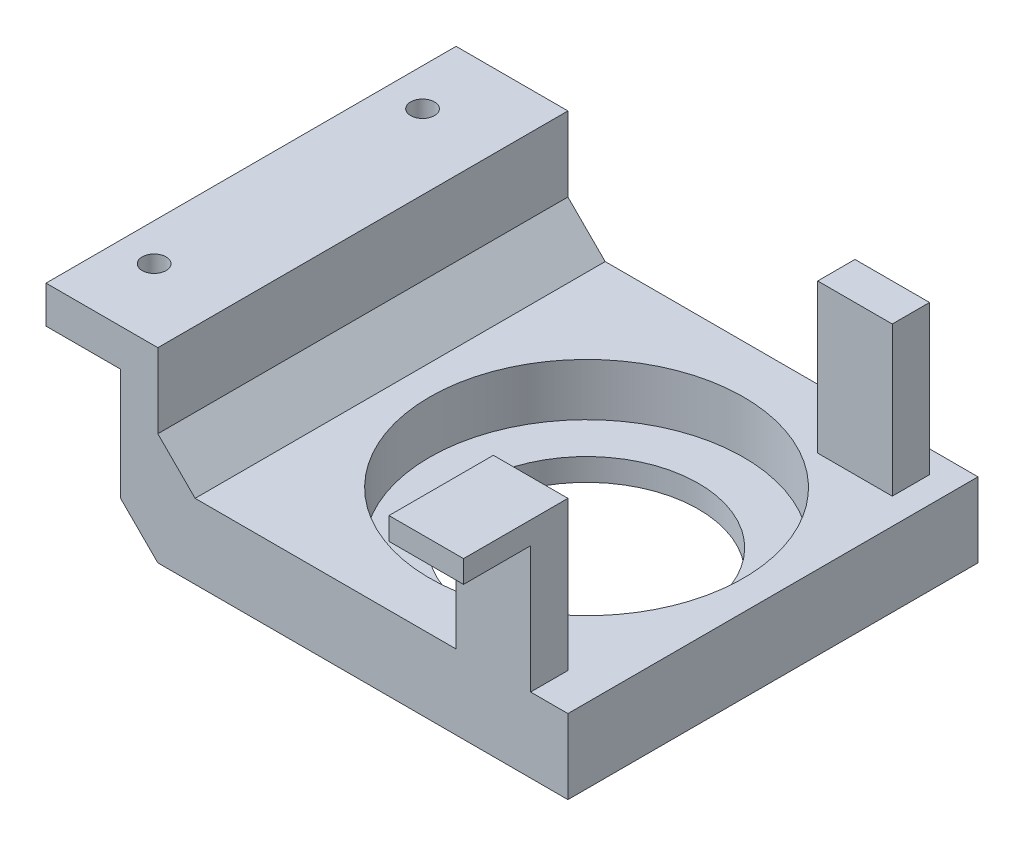
ISO-10303-21;
HEADER;
FILE_DESCRIPTION(('STEP AP214'),'2;1');
FILE_NAME('part.step','',(''),(''),'','','');
FILE_SCHEMA(('AUTOMOTIVE_DESIGN { 1 0 10303 214 1 1 1 1 }'));
ENDSEC;
DATA;
#1=APPLICATION_CONTEXT('core data for automotive mechanical design processes');
#2=APPLICATION_PROTOCOL_DEFINITION('international standard','automotive_design',2000,#1);
#3=PRODUCT_CONTEXT('',#1,'mechanical');
#4=PRODUCT('Part','Part','',(#3));
#5=PRODUCT_RELATED_PRODUCT_CATEGORY('part','',(#4));
#6=PRODUCT_DEFINITION_FORMATION('','',#4);
#7=PRODUCT_DEFINITION_CONTEXT('part definition',#1,'design');
#8=PRODUCT_DEFINITION('design','',#6,#7);
#9=PRODUCT_DEFINITION_SHAPE('','',#8);
#10=(LENGTH_UNIT() NAMED_UNIT(*) SI_UNIT(.MILLI.,.METRE.));
#11=(NAMED_UNIT(*) PLANE_ANGLE_UNIT() SI_UNIT($,.RADIAN.));
#12=(NAMED_UNIT(*) SI_UNIT($,.STERADIAN.) SOLID_ANGLE_UNIT());
#13=UNCERTAINTY_MEASURE_WITH_UNIT(LENGTH_MEASURE(1.E-05),#10,'distance_accuracy_value','');
#14=(GEOMETRIC_REPRESENTATION_CONTEXT(3) GLOBAL_UNCERTAINTY_ASSIGNED_CONTEXT((#13)) GLOBAL_UNIT_ASSIGNED_CONTEXT((#10,
#11,#12)) REPRESENTATION_CONTEXT('',''));
#15=CARTESIAN_POINT('',(0.,0.,0.));
#16=DIRECTION('',(0.,0.,1.));
#17=DIRECTION('',(1.,0.,0.));
#18=AXIS2_PLACEMENT_3D('',#15,#16,#17);
#19=CARTESIAN_POINT('',(-26.4285714285714,4.76190476190476,55.));
#20=DIRECTION('',(0.,-1.,0.));
#21=DIRECTION('',(0.,0.,-1.));
#22=AXIS2_PLACEMENT_3D('',#19,#20,#21);
#23=PLANE('',#22);
#24=DIRECTION('',(0.,0.,-1.));
#25=VECTOR('',#24,1.);
#26=CARTESIAN_POINT('',(23.5714285714286,4.76190476190476,55.));
#27=LINE('',#26,#25);
#28=CARTESIAN_POINT('',(23.5714285714286,4.76190476190476,55.));
#29=VERTEX_POINT('',#28);
#30=CARTESIAN_POINT('',(23.5714285714286,4.76190476190476,50.));
#31=VERTEX_POINT('',#30);
#32=EDGE_CURVE('E223',#29,#31,#27,.T.);
#33=ORIENTED_EDGE('',*,*,#32,.F.);
#34=DIRECTION('',(-1.,0.,0.));
#35=VECTOR('',#34,1.);
#36=CARTESIAN_POINT('',(-26.4285714285714,4.76190476190476,55.));
#37=LINE('',#36,#35);
#38=CARTESIAN_POINT('',(28.5714285714286,4.76190476190476,55.));
#39=VERTEX_POINT('',#38);
#40=EDGE_CURVE('E270',#39,#29,#37,.T.);
#41=ORIENTED_EDGE('',*,*,#40,.F.);
#42=DIRECTION('',(0.,0.,-1.));
#43=VECTOR('',#42,1.);
#44=CARTESIAN_POINT('',(28.5714285714286,4.76190476190476,55.));
#45=LINE('',#44,#43);
#46=CARTESIAN_POINT('',(28.5714285714286,4.76190476190476,0.));
#47=VERTEX_POINT('',#46);
#48=EDGE_CURVE('E319',#39,#47,#45,.T.);
#49=ORIENTED_EDGE('',*,*,#48,.T.);
#50=DIRECTION('',(-1.,0.,0.));
#51=VECTOR('',#50,1.);
#52=CARTESIAN_POINT('',(-26.4285714285714,4.76190476190476,0.));
#53=LINE('',#52,#51);
#54=CARTESIAN_POINT('',(-21.4285714285714,4.76190476190476,0.));
#55=VERTEX_POINT('',#54);
#56=EDGE_CURVE('E289',#47,#55,#53,.T.);
#57=ORIENTED_EDGE('',*,*,#56,.T.);
#58=DIRECTION('',(0.,0.,1.));
#59=VECTOR('',#58,1.);
#60=CARTESIAN_POINT('',(-21.4285714285714,4.76190476190476,55.));
#61=LINE('',#60,#59);
#62=CARTESIAN_POINT('',(-21.4285714285714,4.76190476190476,55.));
#63=VERTEX_POINT('',#62);
#64=EDGE_CURVE('E331',#55,#63,#61,.T.);
#65=ORIENTED_EDGE('',*,*,#64,.T.);
#66=CARTESIAN_POINT('',(13.5714285714286,4.76190476190476,55.));
#67=VERTEX_POINT('',#66);
#68=EDGE_CURVE('E268',#67,#63,#37,.T.);
#69=ORIENTED_EDGE('',*,*,#68,.F.);
#70=DIRECTION('',(0.,0.,1.));
#71=VECTOR('',#70,1.);
#72=CARTESIAN_POINT('',(13.5714285714286,4.76190476190476,50.));
#73=LINE('',#72,#71);
#74=CARTESIAN_POINT('',(13.5714285714286,4.76190476190476,50.));
#75=VERTEX_POINT('',#74);
#76=EDGE_CURVE('E227',#75,#67,#73,.T.);
#77=ORIENTED_EDGE('',*,*,#76,.F.);
#78=DIRECTION('',(-1.,0.,0.));
#79=VECTOR('',#78,1.);
#80=CARTESIAN_POINT('',(23.5714285714286,4.76190476190476,50.));
#81=LINE('',#80,#79);
#82=EDGE_CURVE('E233',#31,#75,#81,.T.);
#83=ORIENTED_EDGE('',*,*,#82,.F.);
#84=EDGE_LOOP('',(#33,#41,#49,#57,#65,#69,#77,#83));
#85=FACE_BOUND('',#84,.T.);
#86=CARTESIAN_POINT('',(3.57142857142857,4.76190476190476,27.5));
#87=DIRECTION('',(0.,1.,0.));
#88=DIRECTION('',(-1.,0.,0.));
#89=AXIS2_PLACEMENT_3D('',#86,#87,#88);
#90=CIRCLE('',#89,21.05);
#91=CARTESIAN_POINT('',(-17.4785714285714,4.76190476190476,27.5));
#92=VERTEX_POINT('',#91);
#93=EDGE_CURVE('E262',#92,#92,#90,.T.);
#94=ORIENTED_EDGE('',*,*,#93,.F.);
#95=EDGE_LOOP('',(#94));
#96=FACE_BOUND('',#95,.T.);
#97=DIRECTION('',(1.,0.,0.));
#98=VECTOR('',#97,1.);
#99=CARTESIAN_POINT('',(15.0714285714324,4.76190476190476,8.00000000000023));
#100=LINE('',#99,#98);
#101=CARTESIAN_POINT('',(15.0714285714324,4.76190476190476,8.00000000000023));
#102=VERTEX_POINT('',#101);
#103=CARTESIAN_POINT('',(25.0714285714324,4.76190476190476,8.00000000000023));
#104=VERTEX_POINT('',#103);
#105=EDGE_CURVE('E198',#102,#104,#100,.T.);
#106=ORIENTED_EDGE('',*,*,#105,.F.);
#107=DIRECTION('',(0.,0.,1.));
#108=VECTOR('',#107,1.);
#109=CARTESIAN_POINT('',(15.0714285714324,4.76190476190476,3.00000000000023));
#110=LINE('',#109,#108);
#111=CARTESIAN_POINT('',(15.0714285714324,4.76190476190476,3.00000000000023));
#112=VERTEX_POINT('',#111);
#113=EDGE_CURVE('E195',#112,#102,#110,.T.);
#114=ORIENTED_EDGE('',*,*,#113,.F.);
#115=DIRECTION('',(-1.,0.,0.));
#116=VECTOR('',#115,1.);
#117=CARTESIAN_POINT('',(25.0714285714324,4.76190476190476,3.00000000000023));
#118=LINE('',#117,#116);
#119=CARTESIAN_POINT('',(25.0714285714324,4.76190476190476,3.00000000000023));
#120=VERTEX_POINT('',#119);
#121=EDGE_CURVE('E62',#120,#112,#118,.T.);
#122=ORIENTED_EDGE('',*,*,#121,.F.);
#123=DIRECTION('',(0.,0.,-1.));
#124=VECTOR('',#123,1.);
#125=CARTESIAN_POINT('',(25.0714285714324,4.76190476190476,8.00000000000023));
#126=LINE('',#125,#124);
#127=EDGE_CURVE('E57',#104,#120,#126,.T.);
#128=ORIENTED_EDGE('',*,*,#127,.F.);
#129=EDGE_LOOP('',(#106,#114,#122,#128));
#130=FACE_BOUND('',#129,.T.);
#131=ADVANCED_FACE('F41',(#85,#96,#130),#23,.F.);
#132=CARTESIAN_POINT('',(28.5714285714286,4.76190476190476,55.));
#133=DIRECTION('',(-1.,0.,0.));
#134=DIRECTION('',(0.,0.,1.));
#135=AXIS2_PLACEMENT_3D('',#132,#133,#134);
#136=PLANE('',#135);
#137=DIRECTION('',(0.,1.,0.));
#138=VECTOR('',#137,1.);
#139=CARTESIAN_POINT('',(28.5714285714286,4.76190476190476,0.));
#140=LINE('',#139,#138);
#141=CARTESIAN_POINT('',(28.5714285714286,-5.23809523809524,0.));
#142=VERTEX_POINT('',#141);
#143=EDGE_CURVE('E261',#142,#47,#140,.T.);
#144=ORIENTED_EDGE('',*,*,#143,.T.);
#145=ORIENTED_EDGE('',*,*,#48,.F.);
#146=DIRECTION('',(0.,1.,0.));
#147=VECTOR('',#146,1.);
#148=CARTESIAN_POINT('',(28.5714285714286,4.76190476190476,55.));
#149=LINE('',#148,#147);
#150=CARTESIAN_POINT('',(28.5714285714286,-5.23809523809524,55.));
#151=VERTEX_POINT('',#150);
#152=EDGE_CURVE('E265',#151,#39,#149,.T.);
#153=ORIENTED_EDGE('',*,*,#152,.F.);
#154=DIRECTION('',(0.,0.,-1.));
#155=VECTOR('',#154,1.);
#156=CARTESIAN_POINT('',(28.5714285714286,-5.23809523809524,55.));
#157=LINE('',#156,#155);
#158=EDGE_CURVE('E286',#151,#142,#157,.T.);
#159=ORIENTED_EDGE('',*,*,#158,.T.);
#160=EDGE_LOOP('',(#144,#145,#153,#159));
#161=FACE_BOUND('',#160,.T.);
#162=ADVANCED_FACE('F390',(#161),#136,.F.);
#163=CARTESIAN_POINT('',(-26.4285714285714,19.7619047619048,55.));
#164=DIRECTION('',(-1.,0.,0.));
#165=DIRECTION('',(0.,-1.,0.));
#166=AXIS2_PLACEMENT_3D('',#163,#164,#165);
#167=PLANE('',#166);
#168=DIRECTION('',(0.,1.,0.));
#169=VECTOR('',#168,1.);
#170=CARTESIAN_POINT('',(-26.4285714285714,19.7619047619048,55.));
#171=LINE('',#170,#169);
#172=CARTESIAN_POINT('',(-26.4285714285714,9.76190476190479,55.));
#173=VERTEX_POINT('',#172);
#174=CARTESIAN_POINT('',(-26.4285714285714,19.7619047619048,55.));
#175=VERTEX_POINT('',#174);
#176=EDGE_CURVE('E273',#173,#175,#171,.T.);
#177=ORIENTED_EDGE('',*,*,#176,.F.);
#178=DIRECTION('',(0.,0.,-1.));
#179=VECTOR('',#178,1.);
#180=CARTESIAN_POINT('',(-26.4285714285714,9.76190476190479,0.));
#181=LINE('',#180,#179);
#182=CARTESIAN_POINT('',(-26.4285714285714,9.76190476190479,0.));
#183=VERTEX_POINT('',#182);
#184=EDGE_CURVE('E322',#173,#183,#181,.T.);
#185=ORIENTED_EDGE('',*,*,#184,.T.);
#186=DIRECTION('',(0.,1.,0.));
#187=VECTOR('',#186,1.);
#188=CARTESIAN_POINT('',(-26.4285714285714,19.7619047619048,0.));
#189=LINE('',#188,#187);
#190=CARTESIAN_POINT('',(-26.4285714285714,19.7619047619048,0.));
#191=VERTEX_POINT('',#190);
#192=EDGE_CURVE('E292',#183,#191,#189,.T.);
#193=ORIENTED_EDGE('',*,*,#192,.T.);
#194=DIRECTION('',(0.,0.,-1.));
#195=VECTOR('',#194,1.);
#196=CARTESIAN_POINT('',(-26.4285714285714,19.7619047619048,55.));
#197=LINE('',#196,#195);
#198=EDGE_CURVE('E316',#175,#191,#197,.T.);
#199=ORIENTED_EDGE('',*,*,#198,.F.);
#200=EDGE_LOOP('',(#177,#185,#193,#199));
#201=FACE_BOUND('',#200,.T.);
#202=ADVANCED_FACE('F363',(#201),#167,.F.);
#203=CARTESIAN_POINT('',(-41.4285714285714,19.7619047619048,55.));
#204=DIRECTION('',(0.,-1.,0.));
#205=DIRECTION('',(1.,0.,0.));
#206=AXIS2_PLACEMENT_3D('',#203,#204,#205);
#207=PLANE('',#206);
#208=CARTESIAN_POINT('',(-36.4285714285714,19.7619047619048,45.5));
#209=DIRECTION('',(0.,-1.,0.));
#210=DIRECTION('',(1.,0.,0.));
#211=AXIS2_PLACEMENT_3D('',#208,#209,#210);
#212=CIRCLE('',#211,1.6);
#213=CARTESIAN_POINT('',(-34.8285714285714,19.7619047619048,45.5));
#214=VERTEX_POINT('',#213);
#215=EDGE_CURVE('E247',#214,#214,#212,.T.);
#216=ORIENTED_EDGE('',*,*,#215,.T.);
#217=EDGE_LOOP('',(#216));
#218=FACE_BOUND('',#217,.T.);
#219=CARTESIAN_POINT('',(-36.4285714285714,19.7619047619048,9.5));
#220=DIRECTION('',(0.,-1.,0.));
#221=DIRECTION('',(-1.,0.,0.));
#222=AXIS2_PLACEMENT_3D('',#219,#220,#221);
#223=CIRCLE('',#222,1.6);
#224=CARTESIAN_POINT('',(-38.0285714285714,19.7619047619048,9.5));
#225=VERTEX_POINT('',#224);
#226=EDGE_CURVE('E246',#225,#225,#223,.T.);
#227=ORIENTED_EDGE('',*,*,#226,.T.);
#228=EDGE_LOOP('',(#227));
#229=FACE_BOUND('',#228,.T.);
#230=DIRECTION('',(-1.,0.,0.));
#231=VECTOR('',#230,1.);
#232=CARTESIAN_POINT('',(-41.4285714285714,19.7619047619048,0.));
#233=LINE('',#232,#231);
#234=CARTESIAN_POINT('',(-41.4285714285714,19.7619047619048,0.));
#235=VERTEX_POINT('',#234);
#236=EDGE_CURVE('E294',#191,#235,#233,.T.);
#237=ORIENTED_EDGE('',*,*,#236,.T.);
#238=DIRECTION('',(0.,0.,-1.));
#239=VECTOR('',#238,1.);
#240=CARTESIAN_POINT('',(-41.4285714285714,19.7619047619048,55.));
#241=LINE('',#240,#239);
#242=CARTESIAN_POINT('',(-41.4285714285714,19.7619047619048,55.));
#243=VERTEX_POINT('',#242);
#244=EDGE_CURVE('E313',#243,#235,#241,.T.);
#245=ORIENTED_EDGE('',*,*,#244,.F.);
#246=DIRECTION('',(-1.,0.,0.));
#247=VECTOR('',#246,1.);
#248=CARTESIAN_POINT('',(-41.4285714285714,19.7619047619048,55.));
#249=LINE('',#248,#247);
#250=EDGE_CURVE('E275',#175,#243,#249,.T.);
#251=ORIENTED_EDGE('',*,*,#250,.F.);
#252=ORIENTED_EDGE('',*,*,#198,.T.);
#253=EDGE_LOOP('',(#237,#245,#251,#252));
#254=FACE_BOUND('',#253,.T.);
#255=ADVANCED_FACE('F367',(#218,#229,#254),#207,.F.);
#256=CARTESIAN_POINT('',(-41.4285714285714,14.7619047619048,55.));
#257=DIRECTION('',(1.,0.,0.));
#258=DIRECTION('',(0.,0.,-1.));
#259=AXIS2_PLACEMENT_3D('',#256,#257,#258);
#260=PLANE('',#259);
#261=DIRECTION('',(0.,-1.,0.));
#262=VECTOR('',#261,1.);
#263=CARTESIAN_POINT('',(-41.4285714285714,14.7619047619048,0.));
#264=LINE('',#263,#262);
#265=CARTESIAN_POINT('',(-41.4285714285714,14.7619047619048,0.));
#266=VERTEX_POINT('',#265);
#267=EDGE_CURVE('E296',#235,#266,#264,.T.);
#268=ORIENTED_EDGE('',*,*,#267,.T.);
#269=DIRECTION('',(0.,0.,-1.));
#270=VECTOR('',#269,1.);
#271=CARTESIAN_POINT('',(-41.4285714285714,14.7619047619048,55.));
#272=LINE('',#271,#270);
#273=CARTESIAN_POINT('',(-41.4285714285714,14.7619047619048,55.));
#274=VERTEX_POINT('',#273);
#275=EDGE_CURVE('E310',#274,#266,#272,.T.);
#276=ORIENTED_EDGE('',*,*,#275,.F.);
#277=DIRECTION('',(0.,-1.,0.));
#278=VECTOR('',#277,1.);
#279=CARTESIAN_POINT('',(-41.4285714285714,14.7619047619048,55.));
#280=LINE('',#279,#278);
#281=EDGE_CURVE('E277',#243,#274,#280,.T.);
#282=ORIENTED_EDGE('',*,*,#281,.F.);
#283=ORIENTED_EDGE('',*,*,#244,.T.);
#284=EDGE_LOOP('',(#268,#276,#282,#283));
#285=FACE_BOUND('',#284,.T.);
#286=ADVANCED_FACE('F373',(#285),#260,.F.);
#287=CARTESIAN_POINT('',(-31.4285714285714,14.7619047619048,55.));
#288=DIRECTION('',(0.,1.,0.));
#289=DIRECTION('',(-1.,0.,0.));
#290=AXIS2_PLACEMENT_3D('',#287,#288,#289);
#291=PLANE('',#290);
#292=CARTESIAN_POINT('',(-36.4285714285714,14.7619047619048,45.5));
#293=DIRECTION('',(0.,1.,0.));
#294=DIRECTION('',(-1.,0.,0.));
#295=AXIS2_PLACEMENT_3D('',#292,#293,#294);
#296=CIRCLE('',#295,1.6);
#297=CARTESIAN_POINT('',(-38.0285714285714,14.7619047619048,45.5));
#298=VERTEX_POINT('',#297);
#299=EDGE_CURVE('E257',#298,#298,#296,.T.);
#300=ORIENTED_EDGE('',*,*,#299,.T.);
#301=EDGE_LOOP('',(#300));
#302=FACE_BOUND('',#301,.T.);
#303=CARTESIAN_POINT('',(-36.4285714285714,14.7619047619048,9.5));
#304=DIRECTION('',(0.,1.,0.));
#305=DIRECTION('',(-1.,0.,0.));
#306=AXIS2_PLACEMENT_3D('',#303,#304,#305);
#307=CIRCLE('',#306,1.6);
#308=CARTESIAN_POINT('',(-38.0285714285714,14.7619047619048,9.5));
#309=VERTEX_POINT('',#308);
#310=EDGE_CURVE('E250',#309,#309,#307,.T.);
#311=ORIENTED_EDGE('',*,*,#310,.T.);
#312=EDGE_LOOP('',(#311));
#313=FACE_BOUND('',#312,.T.);
#314=DIRECTION('',(1.,0.,0.));
#315=VECTOR('',#314,1.);
#316=CARTESIAN_POINT('',(-31.4285714285714,14.7619047619048,0.));
#317=LINE('',#316,#315);
#318=CARTESIAN_POINT('',(-31.4285714285714,14.7619047619048,0.));
#319=VERTEX_POINT('',#318);
#320=EDGE_CURVE('E298',#266,#319,#317,.T.);
#321=ORIENTED_EDGE('',*,*,#320,.T.);
#322=DIRECTION('',(0.,0.,-1.));
#323=VECTOR('',#322,1.);
#324=CARTESIAN_POINT('',(-31.4285714285714,14.7619047619048,55.));
#325=LINE('',#324,#323);
#326=CARTESIAN_POINT('',(-31.4285714285714,14.7619047619048,55.));
#327=VERTEX_POINT('',#326);
#328=EDGE_CURVE('E307',#327,#319,#325,.T.);
#329=ORIENTED_EDGE('',*,*,#328,.F.);
#330=DIRECTION('',(1.,0.,0.));
#331=VECTOR('',#330,1.);
#332=CARTESIAN_POINT('',(-31.4285714285714,14.7619047619048,55.));
#333=LINE('',#332,#331);
#334=EDGE_CURVE('E279',#274,#327,#333,.T.);
#335=ORIENTED_EDGE('',*,*,#334,.F.);
#336=ORIENTED_EDGE('',*,*,#275,.T.);
#337=EDGE_LOOP('',(#321,#329,#335,#336));
#338=FACE_BOUND('',#337,.T.);
#339=ADVANCED_FACE('F377',(#302,#313,#338),#291,.F.);
#340=CARTESIAN_POINT('',(-31.4285714285714,5.76190476190476,55.));
#341=DIRECTION('',(1.,0.,0.));
#342=DIRECTION('',(0.,0.,-1.));
#343=AXIS2_PLACEMENT_3D('',#340,#341,#342);
#344=PLANE('',#343);
#345=DIRECTION('',(0.,-1.,0.));
#346=VECTOR('',#345,1.);
#347=CARTESIAN_POINT('',(-31.4285714285714,5.76190476190476,0.));
#348=LINE('',#347,#346);
#349=CARTESIAN_POINT('',(-31.4285714285714,-0.238095238095233,0.));
#350=VERTEX_POINT('',#349);
#351=EDGE_CURVE('E301',#319,#350,#348,.T.);
#352=ORIENTED_EDGE('',*,*,#351,.T.);
#353=DIRECTION('',(0.,0.,1.));
#354=VECTOR('',#353,1.);
#355=CARTESIAN_POINT('',(-31.4285714285714,-0.238095238095233,55.));
#356=LINE('',#355,#354);
#357=CARTESIAN_POINT('',(-31.4285714285714,-0.238095238095233,55.));
#358=VERTEX_POINT('',#357);
#359=EDGE_CURVE('E339',#350,#358,#356,.T.);
#360=ORIENTED_EDGE('',*,*,#359,.T.);
#361=DIRECTION('',(0.,-1.,0.));
#362=VECTOR('',#361,1.);
#363=CARTESIAN_POINT('',(-31.4285714285714,5.76190476190476,55.));
#364=LINE('',#363,#362);
#365=EDGE_CURVE('E281',#327,#358,#364,.T.);
#366=ORIENTED_EDGE('',*,*,#365,.F.);
#367=ORIENTED_EDGE('',*,*,#328,.T.);
#368=EDGE_LOOP('',(#352,#360,#366,#367));
#369=FACE_BOUND('',#368,.T.);
#370=ADVANCED_FACE('F380',(#369),#344,.F.);
#371=CARTESIAN_POINT('',(-31.4285714285714,-5.23809523809524,55.));
#372=DIRECTION('',(0.,1.,0.));
#373=DIRECTION('',(0.,0.,1.));
#374=AXIS2_PLACEMENT_3D('',#371,#372,#373);
#375=PLANE('',#374);
#376=CARTESIAN_POINT('',(3.57142857142857,-5.23809523809524,27.5));
#377=DIRECTION('',(0.,1.,0.));
#378=DIRECTION('',(-1.,0.,0.));
#379=AXIS2_PLACEMENT_3D('',#376,#377,#378);
#380=CIRCLE('',#379,15.);
#381=CARTESIAN_POINT('',(-11.4285714285714,-5.23809523809524,27.5));
#382=VERTEX_POINT('',#381);
#383=EDGE_CURVE('E253',#382,#382,#380,.T.);
#384=ORIENTED_EDGE('',*,*,#383,.T.);
#385=EDGE_LOOP('',(#384));
#386=FACE_BOUND('',#385,.T.);
#387=DIRECTION('',(1.,0.,0.));
#388=VECTOR('',#387,1.);
#389=CARTESIAN_POINT('',(-31.4285714285714,-5.23809523809524,55.));
#390=LINE('',#389,#388);
#391=CARTESIAN_POINT('',(-26.4285714285714,-5.23809523809524,55.));
#392=VERTEX_POINT('',#391);
#393=EDGE_CURVE('E284',#392,#151,#390,.T.);
#394=ORIENTED_EDGE('',*,*,#393,.F.);
#395=DIRECTION('',(0.,0.,-1.));
#396=VECTOR('',#395,1.);
#397=CARTESIAN_POINT('',(-26.4285714285714,-5.23809523809524,55.));
#398=LINE('',#397,#396);
#399=CARTESIAN_POINT('',(-26.4285714285714,-5.23809523809524,0.));
#400=VERTEX_POINT('',#399);
#401=EDGE_CURVE('E334',#392,#400,#398,.T.);
#402=ORIENTED_EDGE('',*,*,#401,.T.);
#403=DIRECTION('',(1.,0.,0.));
#404=VECTOR('',#403,1.);
#405=CARTESIAN_POINT('',(-31.4285714285714,-5.23809523809524,0.));
#406=LINE('',#405,#404);
#407=EDGE_CURVE('E269',#400,#142,#406,.T.);
#408=ORIENTED_EDGE('',*,*,#407,.T.);
#409=ORIENTED_EDGE('',*,*,#158,.F.);
#410=EDGE_LOOP('',(#394,#402,#408,#409));
#411=FACE_BOUND('',#410,.T.);
#412=ADVANCED_FACE('F387',(#386,#411),#375,.F.);
#413=CARTESIAN_POINT('',(0.,0.,55.));
#414=DIRECTION('',(0.,0.,1.));
#415=DIRECTION('',(1.,0.,0.));
#416=AXIS2_PLACEMENT_3D('',#413,#414,#415);
#417=PLANE('',#416);
#418=DIRECTION('',(1.,0.,0.));
#419=VECTOR('',#418,1.);
#420=CARTESIAN_POINT('',(13.5714285714286,21.7619047619048,55.));
#421=LINE('',#420,#419);
#422=CARTESIAN_POINT('',(13.5714285714286,21.7619047619048,55.));
#423=VERTEX_POINT('',#422);
#424=CARTESIAN_POINT('',(23.5714285714286,21.7619047619048,55.));
#425=VERTEX_POINT('',#424);
#426=EDGE_CURVE('E199',#423,#425,#421,.T.);
#427=ORIENTED_EDGE('',*,*,#426,.F.);
#428=DIRECTION('',(0.,-1.,0.));
#429=VECTOR('',#428,1.);
#430=CARTESIAN_POINT('',(13.5714285714286,24.7619047619048,55.));
#431=LINE('',#430,#429);
#432=EDGE_CURVE('E231',#423,#67,#431,.T.);
#433=ORIENTED_EDGE('',*,*,#432,.T.);
#434=ORIENTED_EDGE('',*,*,#68,.T.);
#435=DIRECTION('',(0.707106781186544,-0.707106781186551,0.));
#436=VECTOR('',#435,1.);
#437=CARTESIAN_POINT('',(-26.4285714285714,9.7619047619048,55.));
#438=LINE('',#437,#436);
#439=EDGE_CURVE('E11',#63,#173,#438,.F.);
#440=ORIENTED_EDGE('',*,*,#439,.T.);
#441=ORIENTED_EDGE('',*,*,#176,.T.);
#442=ORIENTED_EDGE('',*,*,#250,.T.);
#443=ORIENTED_EDGE('',*,*,#281,.T.);
#444=ORIENTED_EDGE('',*,*,#334,.T.);
#445=ORIENTED_EDGE('',*,*,#365,.T.);
#446=DIRECTION('',(-0.707106781186546,0.707106781186549,0.));
#447=VECTOR('',#446,1.);
#448=CARTESIAN_POINT('',(-15.8333333333334,-15.8333333333333,55.));
#449=LINE('',#448,#447);
#450=EDGE_CURVE('E341',#358,#392,#449,.F.);
#451=ORIENTED_EDGE('',*,*,#450,.T.);
#452=ORIENTED_EDGE('',*,*,#393,.T.);
#453=ORIENTED_EDGE('',*,*,#152,.T.);
#454=ORIENTED_EDGE('',*,*,#40,.T.);
#455=DIRECTION('',(0.,-1.,0.));
#456=VECTOR('',#455,1.);
#457=CARTESIAN_POINT('',(23.5714285714286,24.7619047619048,55.));
#458=LINE('',#457,#456);
#459=EDGE_CURVE('E244',#425,#29,#458,.T.);
#460=ORIENTED_EDGE('',*,*,#459,.F.);
#461=EDGE_LOOP('',(#427,#433,#434,#440,#441,#442,#443,#444,#445,#451,#452,#453,#454,#460));
#462=FACE_BOUND('',#461,.T.);
#463=ADVANCED_FACE('F360',(#462),#417,.T.);
#464=CARTESIAN_POINT('',(0.,0.,0.));
#465=DIRECTION('',(0.,0.,1.));
#466=DIRECTION('',(1.,0.,0.));
#467=AXIS2_PLACEMENT_3D('',#464,#465,#466);
#468=PLANE('',#467);
#469=ORIENTED_EDGE('',*,*,#407,.F.);
#470=DIRECTION('',(0.707106781186546,-0.707106781186549,0.));
#471=VECTOR('',#470,1.);
#472=CARTESIAN_POINT('',(-26.4285714285714,-5.23809523809524,0.));
#473=LINE('',#472,#471);
#474=EDGE_CURVE('E337',#400,#350,#473,.F.);
#475=ORIENTED_EDGE('',*,*,#474,.T.);
#476=ORIENTED_EDGE('',*,*,#351,.F.);
#477=ORIENTED_EDGE('',*,*,#320,.F.);
#478=ORIENTED_EDGE('',*,*,#267,.F.);
#479=ORIENTED_EDGE('',*,*,#236,.F.);
#480=ORIENTED_EDGE('',*,*,#192,.F.);
#481=DIRECTION('',(-0.707106781186544,0.707106781186551,0.));
#482=VECTOR('',#481,1.);
#483=CARTESIAN_POINT('',(-8.33333333333343,-8.33333333333336,0.));
#484=LINE('',#483,#482);
#485=EDGE_CURVE('E50',#183,#55,#484,.F.);
#486=ORIENTED_EDGE('',*,*,#485,.T.);
#487=ORIENTED_EDGE('',*,*,#56,.F.);
#488=ORIENTED_EDGE('',*,*,#143,.F.);
#489=EDGE_LOOP('',(#469,#475,#476,#477,#478,#479,#480,#486,#487,#488));
#490=FACE_BOUND('',#489,.T.);
#491=ADVANCED_FACE('F345',(#490),#468,.F.);
#492=CARTESIAN_POINT('',(3.57142857142857,-2.23809523809524,27.5));
#493=DIRECTION('',(0.,1.,0.));
#494=DIRECTION('',(-1.,0.,0.));
#495=AXIS2_PLACEMENT_3D('',#492,#493,#494);
#496=CYLINDRICAL_SURFACE('',#495,21.05);
#497=CARTESIAN_POINT('',(3.57142857142857,-2.23809523809524,27.5));
#498=DIRECTION('',(0.,1.,0.));
#499=DIRECTION('',(-1.,0.,0.));
#500=AXIS2_PLACEMENT_3D('',#497,#498,#499);
#501=CIRCLE('',#500,21.05);
#502=CARTESIAN_POINT('',(-17.4785714285714,-2.23809523809524,27.5));
#503=VERTEX_POINT('',#502);
#504=EDGE_CURVE('E258',#503,#503,#501,.T.);
#505=ORIENTED_EDGE('',*,*,#504,.F.);
#506=EDGE_LOOP('',(#505));
#507=FACE_BOUND('',#506,.T.);
#508=ORIENTED_EDGE('',*,*,#93,.T.);
#509=EDGE_LOOP('',(#508));
#510=FACE_BOUND('',#509,.T.);
#511=ADVANCED_FACE('F466',(#507,#510),#496,.F.);
#512=CARTESIAN_POINT('',(3.57142857142857,-2.23809523809524,27.5));
#513=DIRECTION('',(0.,1.,0.));
#514=DIRECTION('',(-1.,0.,0.));
#515=AXIS2_PLACEMENT_3D('',#512,#513,#514);
#516=PLANE('',#515);
#517=CARTESIAN_POINT('',(3.57142857142857,-2.23809523809524,27.5));
#518=DIRECTION('',(0.,1.,0.));
#519=DIRECTION('',(-1.,0.,0.));
#520=AXIS2_PLACEMENT_3D('',#517,#518,#519);
#521=CIRCLE('',#520,15.);
#522=CARTESIAN_POINT('',(-11.4285714285714,-2.23809523809524,27.5));
#523=VERTEX_POINT('',#522);
#524=EDGE_CURVE('E256',#523,#523,#521,.T.);
#525=ORIENTED_EDGE('',*,*,#524,.F.);
#526=EDGE_LOOP('',(#525));
#527=FACE_BOUND('',#526,.T.);
#528=ORIENTED_EDGE('',*,*,#504,.T.);
#529=EDGE_LOOP('',(#528));
#530=FACE_BOUND('',#529,.T.);
#531=ADVANCED_FACE('F462',(#527,#530),#516,.T.);
#532=CARTESIAN_POINT('',(3.57142857142857,-5.23809523809524,27.5));
#533=DIRECTION('',(0.,1.,0.));
#534=DIRECTION('',(-1.,0.,0.));
#535=AXIS2_PLACEMENT_3D('',#532,#533,#534);
#536=CYLINDRICAL_SURFACE('',#535,15.);
#537=CARTESIAN_POINT('',(-11.4285714285714,-2.23809523809524,27.5));
#538=CARTESIAN_POINT('',(-11.4285714285714,-2.26934523809524,27.5));
#539=CARTESIAN_POINT('',(-11.4285714285714,-2.30059523809524,27.5));
#540=CARTESIAN_POINT('',(-11.4285714285714,-2.36309523809524,27.5));
#541=CARTESIAN_POINT('',(-11.4285714285714,-2.39434523809524,27.5));
#542=CARTESIAN_POINT('',(-11.4285714285714,-2.45684523809524,27.5));
#543=CARTESIAN_POINT('',(-11.4285714285714,-2.48809523809524,27.5));
#544=CARTESIAN_POINT('',(-11.4285714285714,-2.55059523809524,27.5));
#545=CARTESIAN_POINT('',(-11.4285714285714,-2.58184523809524,27.5));
#546=CARTESIAN_POINT('',(-11.4285714285714,-2.64434523809524,27.5));
#547=CARTESIAN_POINT('',(-11.4285714285714,-2.67559523809524,27.5));
#548=CARTESIAN_POINT('',(-11.4285714285714,-2.73809523809524,27.5));
#549=CARTESIAN_POINT('',(-11.4285714285714,-2.76934523809524,27.5));
#550=CARTESIAN_POINT('',(-11.4285714285714,-2.83184523809524,27.5));
#551=CARTESIAN_POINT('',(-11.4285714285714,-2.86309523809524,27.5));
#552=CARTESIAN_POINT('',(-11.4285714285714,-2.92559523809524,27.5));
#553=CARTESIAN_POINT('',(-11.4285714285714,-2.95684523809524,27.5));
#554=CARTESIAN_POINT('',(-11.4285714285714,-3.01934523809524,27.5));
#555=CARTESIAN_POINT('',(-11.4285714285714,-3.05059523809524,27.5));
#556=CARTESIAN_POINT('',(-11.4285714285714,-3.11309523809524,27.5));
#557=CARTESIAN_POINT('',(-11.4285714285714,-3.14434523809524,27.5));
#558=CARTESIAN_POINT('',(-11.4285714285714,-3.20684523809524,27.5));
#559=CARTESIAN_POINT('',(-11.4285714285714,-3.23809523809524,27.5));
#560=CARTESIAN_POINT('',(-11.4285714285714,-3.30059523809524,27.5));
#561=CARTESIAN_POINT('',(-11.4285714285714,-3.33184523809524,27.5));
#562=CARTESIAN_POINT('',(-11.4285714285714,-3.39434523809524,27.5));
#563=CARTESIAN_POINT('',(-11.4285714285714,-3.42559523809524,27.5));
#564=CARTESIAN_POINT('',(-11.4285714285714,-3.48809523809524,27.5));
#565=CARTESIAN_POINT('',(-11.4285714285714,-3.51934523809524,27.5));
#566=CARTESIAN_POINT('',(-11.4285714285714,-3.58184523809524,27.5));
#567=CARTESIAN_POINT('',(-11.4285714285714,-3.61309523809524,27.5));
#568=CARTESIAN_POINT('',(-11.4285714285714,-3.67559523809524,27.5));
#569=CARTESIAN_POINT('',(-11.4285714285714,-3.70684523809524,27.5));
#570=CARTESIAN_POINT('',(-11.4285714285714,-3.76934523809524,27.5));
#571=CARTESIAN_POINT('',(-11.4285714285714,-3.80059523809524,27.5));
#572=CARTESIAN_POINT('',(-11.4285714285714,-3.86309523809524,27.5));
#573=CARTESIAN_POINT('',(-11.4285714285714,-3.89434523809524,27.5));
#574=CARTESIAN_POINT('',(-11.4285714285714,-3.95684523809524,27.5));
#575=CARTESIAN_POINT('',(-11.4285714285714,-3.98809523809524,27.5));
#576=CARTESIAN_POINT('',(-11.4285714285714,-4.05059523809524,27.5));
#577=CARTESIAN_POINT('',(-11.4285714285714,-4.08184523809524,27.5));
#578=CARTESIAN_POINT('',(-11.4285714285714,-4.14434523809524,27.5));
#579=CARTESIAN_POINT('',(-11.4285714285714,-4.17559523809524,27.5));
#580=CARTESIAN_POINT('',(-11.4285714285714,-4.23809523809524,27.5));
#581=CARTESIAN_POINT('',(-11.4285714285714,-4.26934523809524,27.5));
#582=CARTESIAN_POINT('',(-11.4285714285714,-4.33184523809524,27.5));
#583=CARTESIAN_POINT('',(-11.4285714285714,-4.36309523809524,27.5));
#584=CARTESIAN_POINT('',(-11.4285714285714,-4.42559523809524,27.5));
#585=CARTESIAN_POINT('',(-11.4285714285714,-4.45684523809524,27.5));
#586=CARTESIAN_POINT('',(-11.4285714285714,-4.51934523809524,27.5));
#587=CARTESIAN_POINT('',(-11.4285714285714,-4.55059523809524,27.5));
#588=CARTESIAN_POINT('',(-11.4285714285714,-4.61309523809524,27.5));
#589=CARTESIAN_POINT('',(-11.4285714285714,-4.64434523809524,27.5));
#590=CARTESIAN_POINT('',(-11.4285714285714,-4.70684523809524,27.5));
#591=CARTESIAN_POINT('',(-11.4285714285714,-4.73809523809524,27.5));
#592=CARTESIAN_POINT('',(-11.4285714285714,-4.80059523809524,27.5));
#593=CARTESIAN_POINT('',(-11.4285714285714,-4.83184523809524,27.5));
#594=CARTESIAN_POINT('',(-11.4285714285714,-4.89434523809524,27.5));
#595=CARTESIAN_POINT('',(-11.4285714285714,-4.92559523809524,27.5));
#596=CARTESIAN_POINT('',(-11.4285714285714,-4.98809523809524,27.5));
#597=CARTESIAN_POINT('',(-11.4285714285714,-5.01934523809524,27.5));
#598=CARTESIAN_POINT('',(-11.4285714285714,-5.08184523809524,27.5));
#599=CARTESIAN_POINT('',(-11.4285714285714,-5.11309523809524,27.5));
#600=CARTESIAN_POINT('',(-11.4285714285714,-5.17559523809524,27.5));
#601=CARTESIAN_POINT('',(-11.4285714285714,-5.20684523809524,27.5));
#602=CARTESIAN_POINT('',(-11.4285714285714,-5.23809523809524,27.5));
#603=B_SPLINE_CURVE_WITH_KNOTS('',3,(#537,#538,#539,#540,#541,#542,#543,#544,#545,#546,#547,
#548,#549,#550,#551,#552,#553,#554,#555,#556,#557,#558,#559,#560,#561,#562,#563,#564,#565,#566,
#567,#568,#569,#570,#571,#572,#573,#574,#575,#576,#577,#578,#579,#580,#581,#582,#583,#584,#585,
#586,#587,#588,#589,#590,#591,#592,#593,#594,#595,#596,#597,#598,#599,#600,#601,#602),
.UNSPECIFIED.,.F.,.F.,(4,2,2,2,2,2,2,2,2,2,2,2,2,2,2,2,2,2,2,2,2,2,2,2,2,2,2,2,2,2,2,2,4),(0.,
0.0937500000000001,0.1875,0.28125,0.375,0.46875,0.5625,0.65625,0.75,0.84375,0.9375,1.03125,
1.125,1.21875,1.3125,1.40625,1.5,1.59375,1.6875,1.78125,1.875,1.96875,2.0625,2.15625,2.25,
2.34375,2.4375,2.53125,2.625,2.71875,2.8125,2.90625,3.),.UNSPECIFIED.);
#604=EDGE_CURVE('BSEAM453',#523,#382,#603,.T.);
#605=ORIENTED_EDGE('',*,*,#524,.T.);
#606=ORIENTED_EDGE('',*,*,#383,.F.);
#607=ORIENTED_EDGE('',*,*,#604,.T.);
#608=ORIENTED_EDGE('',*,*,#604,.F.);
#609=EDGE_LOOP('',(#605,#607,#606,#608));
#610=FACE_BOUND('',#609,.T.);
#611=ADVANCED_FACE('F453',(#610),#536,.F.);
#612=CARTESIAN_POINT('',(-36.4285714285714,19.7619047619048,9.5));
#613=DIRECTION('',(0.,-1.,0.));
#614=DIRECTION('',(1.,0.,0.));
#615=AXIS2_PLACEMENT_3D('',#612,#613,#614);
#616=CYLINDRICAL_SURFACE('',#615,1.6);
#617=ORIENTED_EDGE('',*,*,#226,.F.);
#618=EDGE_LOOP('',(#617));
#619=FACE_BOUND('',#618,.T.);
#620=ORIENTED_EDGE('',*,*,#310,.F.);
#621=EDGE_LOOP('',(#620));
#622=FACE_BOUND('',#621,.T.);
#623=ADVANCED_FACE('F446',(#619,#622),#616,.F.);
#624=CARTESIAN_POINT('',(-36.4285714285714,19.7619047619048,45.5));
#625=DIRECTION('',(0.,-1.,0.));
#626=DIRECTION('',(1.,0.,0.));
#627=AXIS2_PLACEMENT_3D('',#624,#625,#626);
#628=CYLINDRICAL_SURFACE('',#627,1.6);
#629=ORIENTED_EDGE('',*,*,#215,.F.);
#630=EDGE_LOOP('',(#629));
#631=FACE_BOUND('',#630,.T.);
#632=ORIENTED_EDGE('',*,*,#299,.F.);
#633=EDGE_LOOP('',(#632));
#634=FACE_BOUND('',#633,.T.);
#635=ADVANCED_FACE('F440',(#631,#634),#628,.F.);
#636=CARTESIAN_POINT('',(-26.4285714285714,9.7619047619048,55.));
#637=DIRECTION('',(0.707106781186551,0.707106781186544,0.));
#638=DIRECTION('',(0.,0.,1.));
#639=AXIS2_PLACEMENT_3D('',#636,#637,#638);
#640=PLANE('',#639);
#641=ORIENTED_EDGE('',*,*,#439,.F.);
#642=ORIENTED_EDGE('',*,*,#64,.F.);
#643=ORIENTED_EDGE('',*,*,#485,.F.);
#644=ORIENTED_EDGE('',*,*,#184,.F.);
#645=EDGE_LOOP('',(#641,#642,#643,#644));
#646=FACE_BOUND('',#645,.T.);
#647=ADVANCED_FACE('F357',(#646),#640,.T.);
#648=CARTESIAN_POINT('',(-26.4285714285714,-5.23809523809524,55.));
#649=DIRECTION('',(0.707106781186549,0.707106781186546,0.));
#650=DIRECTION('',(0.,0.,-1.));
#651=AXIS2_PLACEMENT_3D('',#648,#649,#650);
#652=PLANE('',#651);
#653=ORIENTED_EDGE('',*,*,#450,.F.);
#654=ORIENTED_EDGE('',*,*,#359,.F.);
#655=ORIENTED_EDGE('',*,*,#474,.F.);
#656=ORIENTED_EDGE('',*,*,#401,.F.);
#657=EDGE_LOOP('',(#653,#654,#655,#656));
#658=FACE_BOUND('',#657,.T.);
#659=ADVANCED_FACE('F44',(#658),#652,.F.);
#660=CARTESIAN_POINT('',(23.5714285714286,24.7619047619048,55.));
#661=DIRECTION('',(-1.,0.,0.));
#662=DIRECTION('',(0.,0.,1.));
#663=AXIS2_PLACEMENT_3D('',#660,#661,#662);
#664=PLANE('',#663);
#665=ORIENTED_EDGE('',*,*,#32,.T.);
#666=DIRECTION('',(0.,-1.,0.));
#667=VECTOR('',#666,1.);
#668=CARTESIAN_POINT('',(23.5714285714286,24.7619047619048,50.));
#669=LINE('',#668,#667);
#670=CARTESIAN_POINT('',(23.5714285714286,24.7619047619048,50.));
#671=VERTEX_POINT('',#670);
#672=EDGE_CURVE('E241',#671,#31,#669,.T.);
#673=ORIENTED_EDGE('',*,*,#672,.F.);
#674=DIRECTION('',(0.,0.,-1.));
#675=VECTOR('',#674,1.);
#676=CARTESIAN_POINT('',(23.5714285714286,24.7619047619048,55.));
#677=LINE('',#676,#675);
#678=CARTESIAN_POINT('',(23.5714285714286,24.7619047619048,64.));
#679=VERTEX_POINT('',#678);
#680=EDGE_CURVE('E224',#679,#671,#677,.T.);
#681=ORIENTED_EDGE('',*,*,#680,.F.);
#682=DIRECTION('',(0.,1.,0.));
#683=VECTOR('',#682,1.);
#684=CARTESIAN_POINT('',(23.5714285714286,21.7619047619048,64.));
#685=LINE('',#684,#683);
#686=CARTESIAN_POINT('',(23.5714285714286,21.7619047619048,64.));
#687=VERTEX_POINT('',#686);
#688=EDGE_CURVE('E214',#687,#679,#685,.T.);
#689=ORIENTED_EDGE('',*,*,#688,.F.);
#690=DIRECTION('',(0.,0.,-1.));
#691=VECTOR('',#690,1.);
#692=CARTESIAN_POINT('',(23.5714285714286,21.7619047619048,64.));
#693=LINE('',#692,#691);
#694=EDGE_CURVE('E216',#687,#425,#693,.T.);
#695=ORIENTED_EDGE('',*,*,#694,.T.);
#696=ORIENTED_EDGE('',*,*,#459,.T.);
#697=EDGE_LOOP('',(#665,#673,#681,#689,#695,#696));
#698=FACE_BOUND('',#697,.T.);
#699=ADVANCED_FACE('F396',(#698),#664,.F.);
#700=CARTESIAN_POINT('',(23.5714285714286,24.7619047619048,50.));
#701=DIRECTION('',(0.,0.,1.));
#702=DIRECTION('',(1.,0.,0.));
#703=AXIS2_PLACEMENT_3D('',#700,#701,#702);
#704=PLANE('',#703);
#705=ORIENTED_EDGE('',*,*,#82,.T.);
#706=DIRECTION('',(0.,-1.,0.));
#707=VECTOR('',#706,1.);
#708=CARTESIAN_POINT('',(13.5714285714286,24.7619047619048,50.));
#709=LINE('',#708,#707);
#710=CARTESIAN_POINT('',(13.5714285714286,24.7619047619048,50.));
#711=VERTEX_POINT('',#710);
#712=EDGE_CURVE('E238',#711,#75,#709,.T.);
#713=ORIENTED_EDGE('',*,*,#712,.F.);
#714=DIRECTION('',(-1.,0.,0.));
#715=VECTOR('',#714,1.);
#716=CARTESIAN_POINT('',(23.5714285714286,24.7619047619048,50.));
#717=LINE('',#716,#715);
#718=EDGE_CURVE('E226',#671,#711,#717,.T.);
#719=ORIENTED_EDGE('',*,*,#718,.F.);
#720=ORIENTED_EDGE('',*,*,#672,.T.);
#721=EDGE_LOOP('',(#705,#713,#719,#720));
#722=FACE_BOUND('',#721,.T.);
#723=ADVANCED_FACE('F399',(#722),#704,.F.);
#724=CARTESIAN_POINT('',(13.5714285714286,24.7619047619048,50.));
#725=DIRECTION('',(1.,0.,0.));
#726=DIRECTION('',(0.,0.,-1.));
#727=AXIS2_PLACEMENT_3D('',#724,#725,#726);
#728=PLANE('',#727);
#729=ORIENTED_EDGE('',*,*,#76,.T.);
#730=ORIENTED_EDGE('',*,*,#432,.F.);
#731=DIRECTION('',(0.,0.,-1.));
#732=VECTOR('',#731,1.);
#733=CARTESIAN_POINT('',(13.5714285714286,21.7619047619048,64.));
#734=LINE('',#733,#732);
#735=CARTESIAN_POINT('',(13.5714285714286,21.7619047619048,64.));
#736=VERTEX_POINT('',#735);
#737=EDGE_CURVE('E220',#736,#423,#734,.T.);
#738=ORIENTED_EDGE('',*,*,#737,.F.);
#739=DIRECTION('',(0.,-1.,0.));
#740=VECTOR('',#739,1.);
#741=CARTESIAN_POINT('',(13.5714285714286,24.7619047619048,64.));
#742=LINE('',#741,#740);
#743=CARTESIAN_POINT('',(13.5714285714286,24.7619047619048,64.));
#744=VERTEX_POINT('',#743);
#745=EDGE_CURVE('E210',#744,#736,#742,.T.);
#746=ORIENTED_EDGE('',*,*,#745,.F.);
#747=DIRECTION('',(0.,0.,1.));
#748=VECTOR('',#747,1.);
#749=CARTESIAN_POINT('',(13.5714285714286,24.7619047619048,50.));
#750=LINE('',#749,#748);
#751=EDGE_CURVE('E229',#711,#744,#750,.T.);
#752=ORIENTED_EDGE('',*,*,#751,.F.);
#753=ORIENTED_EDGE('',*,*,#712,.T.);
#754=EDGE_LOOP('',(#729,#730,#738,#746,#752,#753));
#755=FACE_BOUND('',#754,.T.);
#756=ADVANCED_FACE('F416',(#755),#728,.F.);
#757=CARTESIAN_POINT('',(0.,24.7619047619048,0.));
#758=DIRECTION('',(0.,1.,0.));
#759=DIRECTION('',(0.,0.,1.));
#760=AXIS2_PLACEMENT_3D('',#757,#758,#759);
#761=PLANE('',#760);
#762=ORIENTED_EDGE('',*,*,#751,.T.);
#763=DIRECTION('',(-1.,0.,0.));
#764=VECTOR('',#763,1.);
#765=CARTESIAN_POINT('',(23.5714285714286,24.7619047619048,64.));
#766=LINE('',#765,#764);
#767=EDGE_CURVE('E202',#679,#744,#766,.T.);
#768=ORIENTED_EDGE('',*,*,#767,.F.);
#769=ORIENTED_EDGE('',*,*,#680,.T.);
#770=ORIENTED_EDGE('',*,*,#718,.T.);
#771=EDGE_LOOP('',(#762,#768,#769,#770));
#772=FACE_BOUND('',#771,.T.);
#773=ADVANCED_FACE('F403',(#772),#761,.T.);
#774=CARTESIAN_POINT('',(13.5714285714286,21.7619047619048,64.));
#775=DIRECTION('',(0.,1.,0.));
#776=DIRECTION('',(0.,0.,1.));
#777=AXIS2_PLACEMENT_3D('',#774,#775,#776);
#778=PLANE('',#777);
#779=ORIENTED_EDGE('',*,*,#426,.T.);
#780=ORIENTED_EDGE('',*,*,#694,.F.);
#781=DIRECTION('',(1.,0.,0.));
#782=VECTOR('',#781,1.);
#783=CARTESIAN_POINT('',(13.5714285714286,21.7619047619048,64.));
#784=LINE('',#783,#782);
#785=EDGE_CURVE('E212',#736,#687,#784,.T.);
#786=ORIENTED_EDGE('',*,*,#785,.F.);
#787=ORIENTED_EDGE('',*,*,#737,.T.);
#788=EDGE_LOOP('',(#779,#780,#786,#787));
#789=FACE_BOUND('',#788,.T.);
#790=ADVANCED_FACE('F413',(#789),#778,.F.);
#791=CARTESIAN_POINT('',(0.,0.,64.));
#792=DIRECTION('',(0.,0.,1.));
#793=DIRECTION('',(1.,0.,0.));
#794=AXIS2_PLACEMENT_3D('',#791,#792,#793);
#795=PLANE('',#794);
#796=ORIENTED_EDGE('',*,*,#767,.T.);
#797=ORIENTED_EDGE('',*,*,#745,.T.);
#798=ORIENTED_EDGE('',*,*,#785,.T.);
#799=ORIENTED_EDGE('',*,*,#688,.T.);
#800=EDGE_LOOP('',(#796,#797,#798,#799));
#801=FACE_BOUND('',#800,.T.);
#802=ADVANCED_FACE('F408',(#801),#795,.T.);
#803=CARTESIAN_POINT('',(15.0714285714324,24.7619047619048,8.00000000000023));
#804=DIRECTION('',(0.,0.,-1.));
#805=DIRECTION('',(-1.,0.,0.));
#806=AXIS2_PLACEMENT_3D('',#803,#804,#805);
#807=PLANE('',#806);
#808=ORIENTED_EDGE('',*,*,#105,.T.);
#809=DIRECTION('',(0.,-1.,0.));
#810=VECTOR('',#809,1.);
#811=CARTESIAN_POINT('',(25.0714285714324,24.7619047619048,8.00000000000023));
#812=LINE('',#811,#810);
#813=CARTESIAN_POINT('',(25.0714285714324,24.7619047619048,8.00000000000023));
#814=VERTEX_POINT('',#813);
#815=EDGE_CURVE('E179',#814,#104,#812,.T.);
#816=ORIENTED_EDGE('',*,*,#815,.F.);
#817=DIRECTION('',(1.,0.,0.));
#818=VECTOR('',#817,1.);
#819=CARTESIAN_POINT('',(15.0714285714324,24.7619047619048,8.00000000000023));
#820=LINE('',#819,#818);
#821=CARTESIAN_POINT('',(15.0714285714324,24.7619047619048,8.00000000000023));
#822=VERTEX_POINT('',#821);
#823=EDGE_CURVE('E186',#822,#814,#820,.T.);
#824=ORIENTED_EDGE('',*,*,#823,.F.);
#825=DIRECTION('',(0.,-1.,0.));
#826=VECTOR('',#825,1.);
#827=CARTESIAN_POINT('',(15.0714285714324,24.7619047619048,8.00000000000023));
#828=LINE('',#827,#826);
#829=EDGE_CURVE('E654',#822,#102,#828,.T.);
#830=ORIENTED_EDGE('',*,*,#829,.T.);
#831=EDGE_LOOP('',(#808,#816,#824,#830));
#832=FACE_BOUND('',#831,.T.);
#833=ADVANCED_FACE('F197',(#832),#807,.F.);
#834=CARTESIAN_POINT('',(25.0714285714324,24.7619047619048,8.00000000000023));
#835=DIRECTION('',(-1.,0.,0.));
#836=DIRECTION('',(0.,0.,1.));
#837=AXIS2_PLACEMENT_3D('',#834,#835,#836);
#838=PLANE('',#837);
#839=ORIENTED_EDGE('',*,*,#127,.T.);
#840=DIRECTION('',(0.,-1.,0.));
#841=VECTOR('',#840,1.);
#842=CARTESIAN_POINT('',(25.0714285714324,24.7619047619048,3.00000000000023));
#843=LINE('',#842,#841);
#844=CARTESIAN_POINT('',(25.0714285714324,24.7619047619048,3.00000000000023));
#845=VERTEX_POINT('',#844);
#846=EDGE_CURVE('E182',#845,#120,#843,.T.);
#847=ORIENTED_EDGE('',*,*,#846,.F.);
#848=DIRECTION('',(0.,0.,-1.));
#849=VECTOR('',#848,1.);
#850=CARTESIAN_POINT('',(25.0714285714324,24.7619047619048,8.00000000000023));
#851=LINE('',#850,#849);
#852=EDGE_CURVE('E175',#814,#845,#851,.T.);
#853=ORIENTED_EDGE('',*,*,#852,.F.);
#854=ORIENTED_EDGE('',*,*,#815,.T.);
#855=EDGE_LOOP('',(#839,#847,#853,#854));
#856=FACE_BOUND('',#855,.T.);
#857=ADVANCED_FACE('F177',(#856),#838,.F.);
#858=CARTESIAN_POINT('',(25.0714285714324,24.7619047619048,3.00000000000023));
#859=DIRECTION('',(0.,0.,1.));
#860=DIRECTION('',(1.,0.,0.));
#861=AXIS2_PLACEMENT_3D('',#858,#859,#860);
#862=PLANE('',#861);
#863=ORIENTED_EDGE('',*,*,#121,.T.);
#864=DIRECTION('',(0.,-1.,0.));
#865=VECTOR('',#864,1.);
#866=CARTESIAN_POINT('',(15.0714285714324,24.7619047619048,3.00000000000023));
#867=LINE('',#866,#865);
#868=CARTESIAN_POINT('',(15.0714285714324,24.7619047619048,3.00000000000023));
#869=VERTEX_POINT('',#868);
#870=EDGE_CURVE('E204',#869,#112,#867,.T.);
#871=ORIENTED_EDGE('',*,*,#870,.F.);
#872=DIRECTION('',(-1.,0.,0.));
#873=VECTOR('',#872,1.);
#874=CARTESIAN_POINT('',(25.0714285714324,24.7619047619048,3.00000000000023));
#875=LINE('',#874,#873);
#876=EDGE_CURVE('E185',#845,#869,#875,.T.);
#877=ORIENTED_EDGE('',*,*,#876,.F.);
#878=ORIENTED_EDGE('',*,*,#846,.T.);
#879=EDGE_LOOP('',(#863,#871,#877,#878));
#880=FACE_BOUND('',#879,.T.);
#881=ADVANCED_FACE('F622',(#880),#862,.F.);
#882=CARTESIAN_POINT('',(15.0714285714324,24.7619047619048,3.00000000000023));
#883=DIRECTION('',(1.,0.,0.));
#884=DIRECTION('',(0.,0.,-1.));
#885=AXIS2_PLACEMENT_3D('',#882,#883,#884);
#886=PLANE('',#885);
#887=ORIENTED_EDGE('',*,*,#113,.T.);
#888=ORIENTED_EDGE('',*,*,#829,.F.);
#889=DIRECTION('',(0.,0.,1.));
#890=VECTOR('',#889,1.);
#891=CARTESIAN_POINT('',(15.0714285714324,24.7619047619048,3.00000000000023));
#892=LINE('',#891,#890);
#893=EDGE_CURVE('E191',#869,#822,#892,.T.);
#894=ORIENTED_EDGE('',*,*,#893,.F.);
#895=ORIENTED_EDGE('',*,*,#870,.T.);
#896=EDGE_LOOP('',(#887,#888,#894,#895));
#897=FACE_BOUND('',#896,.T.);
#898=ADVANCED_FACE('F631',(#897),#886,.F.);
#899=CARTESIAN_POINT('',(0.,24.7619047619048,0.));
#900=DIRECTION('',(0.,1.,0.));
#901=DIRECTION('',(0.,0.,1.));
#902=AXIS2_PLACEMENT_3D('',#899,#900,#901);
#903=PLANE('',#902);
#904=ORIENTED_EDGE('',*,*,#823,.T.);
#905=ORIENTED_EDGE('',*,*,#852,.T.);
#906=ORIENTED_EDGE('',*,*,#876,.T.);
#907=ORIENTED_EDGE('',*,*,#893,.T.);
#908=EDGE_LOOP('',(#904,#905,#906,#907));
#909=FACE_BOUND('',#908,.T.);
#910=ADVANCED_FACE('F189',(#909),#903,.T.);
#911=CLOSED_SHELL('',(#131,#162,#202,#255,#286,#339,#370,#412,#463,#491,#511,#531,#611,#623,
#635,#647,#659,#699,#723,#756,#773,#790,#802,#833,#857,#881,#898,#910));
#912=MANIFOLD_SOLID_BREP('B2',#911);
#913=ADVANCED_BREP_SHAPE_REPRESENTATION('',(#18,#912),#14);
#914=SHAPE_DEFINITION_REPRESENTATION(#9,#913);
ENDSEC;
END-ISO-10303-21;
